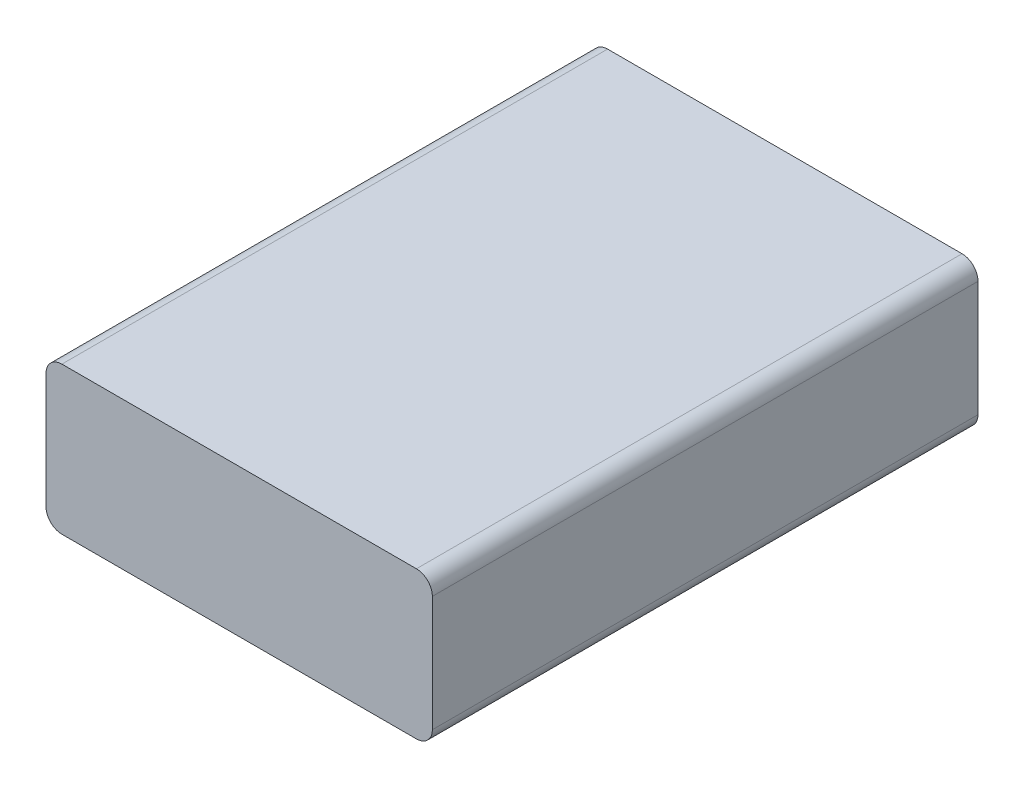
ISO-10303-21;
HEADER;
FILE_DESCRIPTION(('STEP AP214'),'2;1');
FILE_NAME('part.step','',(''),(''),'','','');
FILE_SCHEMA(('AUTOMOTIVE_DESIGN { 1 0 10303 214 1 1 1 1 }'));
ENDSEC;
DATA;
#1=APPLICATION_CONTEXT('core data for automotive mechanical design processes');
#2=APPLICATION_PROTOCOL_DEFINITION('international standard','automotive_design',2000,#1);
#3=PRODUCT_CONTEXT('',#1,'mechanical');
#4=PRODUCT('Part','Part','',(#3));
#5=PRODUCT_RELATED_PRODUCT_CATEGORY('part','',(#4));
#6=PRODUCT_DEFINITION_FORMATION('','',#4);
#7=PRODUCT_DEFINITION_CONTEXT('part definition',#1,'design');
#8=PRODUCT_DEFINITION('design','',#6,#7);
#9=PRODUCT_DEFINITION_SHAPE('','',#8);
#10=(LENGTH_UNIT() NAMED_UNIT(*) SI_UNIT(.MILLI.,.METRE.));
#11=(NAMED_UNIT(*) PLANE_ANGLE_UNIT() SI_UNIT($,.RADIAN.));
#12=(NAMED_UNIT(*) SI_UNIT($,.STERADIAN.) SOLID_ANGLE_UNIT());
#13=UNCERTAINTY_MEASURE_WITH_UNIT(LENGTH_MEASURE(1.E-05),#10,'distance_accuracy_value','');
#14=(GEOMETRIC_REPRESENTATION_CONTEXT(3) GLOBAL_UNCERTAINTY_ASSIGNED_CONTEXT((#13)) GLOBAL_UNIT_ASSIGNED_CONTEXT((#10,
#11,#12)) REPRESENTATION_CONTEXT('',''));
#15=CARTESIAN_POINT('',(0.,0.,0.));
#16=DIRECTION('',(0.,0.,1.));
#17=DIRECTION('',(1.,0.,0.));
#18=AXIS2_PLACEMENT_3D('',#15,#16,#17);
#19=CARTESIAN_POINT('',(24.25,18.5,34.25));
#20=DIRECTION('',(-1.,0.,0.));
#21=DIRECTION('',(0.,0.,1.));
#22=AXIS2_PLACEMENT_3D('',#19,#20,#21);
#23=PLANE('',#22);
#24=DIRECTION('',(0.,-1.,0.));
#25=VECTOR('',#24,1.);
#26=CARTESIAN_POINT('',(24.25,18.5,34.25));
#27=LINE('',#26,#25);
#28=CARTESIAN_POINT('',(24.25,16.5,34.25));
#29=VERTEX_POINT('',#28);
#30=CARTESIAN_POINT('',(24.25,2.,34.25));
#31=VERTEX_POINT('',#30);
#32=EDGE_CURVE('E132',#29,#31,#27,.T.);
#33=ORIENTED_EDGE('',*,*,#32,.T.);
#34=DIRECTION('',(0.,0.,-1.));
#35=VECTOR('',#34,1.);
#36=CARTESIAN_POINT('',(24.25,2.,-34.25));
#37=LINE('',#36,#35);
#38=CARTESIAN_POINT('',(24.25,2.,-34.25));
#39=VERTEX_POINT('',#38);
#40=EDGE_CURVE('E171',#31,#39,#37,.T.);
#41=ORIENTED_EDGE('',*,*,#40,.T.);
#42=DIRECTION('',(0.,-1.,0.));
#43=VECTOR('',#42,1.);
#44=CARTESIAN_POINT('',(24.25,18.5,-34.25));
#45=LINE('',#44,#43);
#46=CARTESIAN_POINT('',(24.25,16.5,-34.25));
#47=VERTEX_POINT('',#46);
#48=EDGE_CURVE('E138',#47,#39,#45,.T.);
#49=ORIENTED_EDGE('',*,*,#48,.F.);
#50=DIRECTION('',(0.,0.,-1.));
#51=VECTOR('',#50,1.);
#52=CARTESIAN_POINT('',(24.25,16.5,34.25));
#53=LINE('',#52,#51);
#54=EDGE_CURVE('E168',#47,#29,#53,.F.);
#55=ORIENTED_EDGE('',*,*,#54,.T.);
#56=EDGE_LOOP('',(#33,#41,#49,#55));
#57=FACE_BOUND('',#56,.T.);
#58=ADVANCED_FACE('F41',(#57),#23,.F.);
#59=CARTESIAN_POINT('',(-24.25,18.5,-34.25));
#60=DIRECTION('',(0.,0.,1.));
#61=DIRECTION('',(1.,0.,0.));
#62=AXIS2_PLACEMENT_3D('',#59,#60,#61);
#63=PLANE('',#62);
#64=DIRECTION('',(-1.,0.,0.));
#65=VECTOR('',#64,1.);
#66=CARTESIAN_POINT('',(-24.25,0.,-34.25));
#67=LINE('',#66,#65);
#68=CARTESIAN_POINT('',(22.25,0.,-34.25));
#69=VERTEX_POINT('',#68);
#70=CARTESIAN_POINT('',(-22.25,0.,-34.25));
#71=VERTEX_POINT('',#70);
#72=EDGE_CURVE('E191',#69,#71,#67,.T.);
#73=ORIENTED_EDGE('',*,*,#72,.T.);
#74=CARTESIAN_POINT('',(-22.25,2.,-34.25));
#75=DIRECTION('',(0.,0.,1.));
#76=DIRECTION('',(1.,0.,0.));
#77=AXIS2_PLACEMENT_3D('',#74,#75,#76);
#78=CIRCLE('',#77,2.);
#79=CARTESIAN_POINT('',(-24.25,2.,-34.25));
#80=VERTEX_POINT('',#79);
#81=EDGE_CURVE('E165',#71,#80,#78,.F.);
#82=ORIENTED_EDGE('',*,*,#81,.T.);
#83=DIRECTION('',(0.,-1.,0.));
#84=VECTOR('',#83,1.);
#85=CARTESIAN_POINT('',(-24.25,18.5,-34.25));
#86=LINE('',#85,#84);
#87=CARTESIAN_POINT('',(-24.25,16.5,-34.25));
#88=VERTEX_POINT('',#87);
#89=EDGE_CURVE('E131',#88,#80,#86,.T.);
#90=ORIENTED_EDGE('',*,*,#89,.F.);
#91=CARTESIAN_POINT('',(-22.25,16.5,-34.25));
#92=DIRECTION('',(0.,0.,1.));
#93=DIRECTION('',(1.,0.,0.));
#94=AXIS2_PLACEMENT_3D('',#91,#92,#93);
#95=CIRCLE('',#94,2.);
#96=CARTESIAN_POINT('',(-22.25,18.5,-34.25));
#97=VERTEX_POINT('',#96);
#98=EDGE_CURVE('E136',#88,#97,#95,.F.);
#99=ORIENTED_EDGE('',*,*,#98,.T.);
#100=DIRECTION('',(-1.,0.,0.));
#101=VECTOR('',#100,1.);
#102=CARTESIAN_POINT('',(-24.25,18.5,-34.25));
#103=LINE('',#102,#101);
#104=CARTESIAN_POINT('',(22.25,18.5,-34.25));
#105=VERTEX_POINT('',#104);
#106=EDGE_CURVE('E179',#105,#97,#103,.T.);
#107=ORIENTED_EDGE('',*,*,#106,.F.);
#108=CARTESIAN_POINT('',(22.25,16.5,-34.25));
#109=DIRECTION('',(0.,0.,1.));
#110=DIRECTION('',(1.,0.,0.));
#111=AXIS2_PLACEMENT_3D('',#108,#109,#110);
#112=CIRCLE('',#111,2.);
#113=EDGE_CURVE('E65',#105,#47,#112,.F.);
#114=ORIENTED_EDGE('',*,*,#113,.T.);
#115=ORIENTED_EDGE('',*,*,#48,.T.);
#116=CARTESIAN_POINT('',(22.25,2.,-34.25));
#117=DIRECTION('',(0.,0.,1.));
#118=DIRECTION('',(1.,0.,0.));
#119=AXIS2_PLACEMENT_3D('',#116,#117,#118);
#120=CIRCLE('',#119,2.);
#121=EDGE_CURVE('E57',#39,#69,#120,.F.);
#122=ORIENTED_EDGE('',*,*,#121,.T.);
#123=EDGE_LOOP('',(#73,#82,#90,#99,#107,#114,#115,#122));
#124=FACE_BOUND('',#123,.T.);
#125=ADVANCED_FACE('F183',(#124),#63,.F.);
#126=CARTESIAN_POINT('',(-24.25,18.5,34.25));
#127=DIRECTION('',(1.,0.,0.));
#128=DIRECTION('',(0.,0.,-1.));
#129=AXIS2_PLACEMENT_3D('',#126,#127,#128);
#130=PLANE('',#129);
#131=ORIENTED_EDGE('',*,*,#89,.T.);
#132=DIRECTION('',(0.,0.,1.));
#133=VECTOR('',#132,1.);
#134=CARTESIAN_POINT('',(-24.25,2.,34.25));
#135=LINE('',#134,#133);
#136=CARTESIAN_POINT('',(-24.25,2.,34.25));
#137=VERTEX_POINT('',#136);
#138=EDGE_CURVE('E129',#80,#137,#135,.T.);
#139=ORIENTED_EDGE('',*,*,#138,.T.);
#140=DIRECTION('',(0.,-1.,0.));
#141=VECTOR('',#140,1.);
#142=CARTESIAN_POINT('',(-24.25,18.5,34.25));
#143=LINE('',#142,#141);
#144=CARTESIAN_POINT('',(-24.25,16.5,34.25));
#145=VERTEX_POINT('',#144);
#146=EDGE_CURVE('E112',#145,#137,#143,.T.);
#147=ORIENTED_EDGE('',*,*,#146,.F.);
#148=DIRECTION('',(0.,0.,1.));
#149=VECTOR('',#148,1.);
#150=CARTESIAN_POINT('',(-24.25,16.5,34.25));
#151=LINE('',#150,#149);
#152=EDGE_CURVE('E126',#145,#88,#151,.F.);
#153=ORIENTED_EDGE('',*,*,#152,.T.);
#154=EDGE_LOOP('',(#131,#139,#147,#153));
#155=FACE_BOUND('',#154,.T.);
#156=ADVANCED_FACE('F125',(#155),#130,.F.);
#157=CARTESIAN_POINT('',(-24.25,18.5,34.25));
#158=DIRECTION('',(0.,0.,-1.));
#159=DIRECTION('',(-1.,0.,0.));
#160=AXIS2_PLACEMENT_3D('',#157,#158,#159);
#161=PLANE('',#160);
#162=ORIENTED_EDGE('',*,*,#146,.T.);
#163=CARTESIAN_POINT('',(-22.25,2.,34.25));
#164=DIRECTION('',(0.,0.,-1.));
#165=DIRECTION('',(-1.,0.,0.));
#166=AXIS2_PLACEMENT_3D('',#163,#164,#165);
#167=CIRCLE('',#166,2.);
#168=CARTESIAN_POINT('',(-22.25,0.,34.25));
#169=VERTEX_POINT('',#168);
#170=EDGE_CURVE('E150',#137,#169,#167,.F.);
#171=ORIENTED_EDGE('',*,*,#170,.T.);
#172=DIRECTION('',(1.,0.,0.));
#173=VECTOR('',#172,1.);
#174=CARTESIAN_POINT('',(-24.25,0.,34.25));
#175=LINE('',#174,#173);
#176=CARTESIAN_POINT('',(22.25,0.,34.25));
#177=VERTEX_POINT('',#176);
#178=EDGE_CURVE('E185',#169,#177,#175,.T.);
#179=ORIENTED_EDGE('',*,*,#178,.T.);
#180=CARTESIAN_POINT('',(22.25,2.,34.25));
#181=DIRECTION('',(0.,0.,-1.));
#182=DIRECTION('',(-1.,0.,0.));
#183=AXIS2_PLACEMENT_3D('',#180,#181,#182);
#184=CIRCLE('',#183,2.);
#185=EDGE_CURVE('E119',#177,#31,#184,.F.);
#186=ORIENTED_EDGE('',*,*,#185,.T.);
#187=ORIENTED_EDGE('',*,*,#32,.F.);
#188=CARTESIAN_POINT('',(22.25,16.5,34.25));
#189=DIRECTION('',(0.,0.,-1.));
#190=DIRECTION('',(-1.,0.,0.));
#191=AXIS2_PLACEMENT_3D('',#188,#189,#190);
#192=CIRCLE('',#191,2.);
#193=CARTESIAN_POINT('',(22.25,18.5,34.25));
#194=VERTEX_POINT('',#193);
#195=EDGE_CURVE('E120',#29,#194,#192,.F.);
#196=ORIENTED_EDGE('',*,*,#195,.T.);
#197=DIRECTION('',(1.,0.,0.));
#198=VECTOR('',#197,1.);
#199=CARTESIAN_POINT('',(-24.25,18.5,34.25));
#200=LINE('',#199,#198);
#201=CARTESIAN_POINT('',(-22.25,18.5,34.25));
#202=VERTEX_POINT('',#201);
#203=EDGE_CURVE('E114',#202,#194,#200,.T.);
#204=ORIENTED_EDGE('',*,*,#203,.F.);
#205=CARTESIAN_POINT('',(-22.25,16.5,34.25));
#206=DIRECTION('',(0.,0.,-1.));
#207=DIRECTION('',(-1.,0.,0.));
#208=AXIS2_PLACEMENT_3D('',#205,#206,#207);
#209=CIRCLE('',#208,2.);
#210=EDGE_CURVE('E109',#202,#145,#209,.F.);
#211=ORIENTED_EDGE('',*,*,#210,.T.);
#212=EDGE_LOOP('',(#162,#171,#179,#186,#187,#196,#204,#211));
#213=FACE_BOUND('',#212,.T.);
#214=ADVANCED_FACE('F111',(#213),#161,.F.);
#215=CARTESIAN_POINT('',(0.,18.5,0.));
#216=DIRECTION('',(0.,-1.,0.));
#217=DIRECTION('',(0.,0.,-1.));
#218=AXIS2_PLACEMENT_3D('',#215,#216,#217);
#219=PLANE('',#218);
#220=ORIENTED_EDGE('',*,*,#106,.T.);
#221=DIRECTION('',(0.,0.,1.));
#222=VECTOR('',#221,1.);
#223=CARTESIAN_POINT('',(-22.25,18.5,0.));
#224=LINE('',#223,#222);
#225=EDGE_CURVE('E11',#97,#202,#224,.T.);
#226=ORIENTED_EDGE('',*,*,#225,.T.);
#227=ORIENTED_EDGE('',*,*,#203,.T.);
#228=DIRECTION('',(0.,0.,-1.));
#229=VECTOR('',#228,1.);
#230=CARTESIAN_POINT('',(22.25,18.5,0.));
#231=LINE('',#230,#229);
#232=EDGE_CURVE('E50',#194,#105,#231,.T.);
#233=ORIENTED_EDGE('',*,*,#232,.T.);
#234=EDGE_LOOP('',(#220,#226,#227,#233));
#235=FACE_BOUND('',#234,.T.);
#236=ADVANCED_FACE('F178',(#235),#219,.F.);
#237=CARTESIAN_POINT('',(0.,0.,0.));
#238=DIRECTION('',(0.,-1.,0.));
#239=DIRECTION('',(0.,0.,-1.));
#240=AXIS2_PLACEMENT_3D('',#237,#238,#239);
#241=PLANE('',#240);
#242=ORIENTED_EDGE('',*,*,#178,.F.);
#243=DIRECTION('',(0.,0.,1.));
#244=VECTOR('',#243,1.);
#245=CARTESIAN_POINT('',(-22.25,0.,-34.25));
#246=LINE('',#245,#244);
#247=EDGE_CURVE('E156',#169,#71,#246,.F.);
#248=ORIENTED_EDGE('',*,*,#247,.T.);
#249=ORIENTED_EDGE('',*,*,#72,.F.);
#250=DIRECTION('',(0.,0.,-1.));
#251=VECTOR('',#250,1.);
#252=CARTESIAN_POINT('',(22.25,0.,34.25));
#253=LINE('',#252,#251);
#254=EDGE_CURVE('E153',#69,#177,#253,.F.);
#255=ORIENTED_EDGE('',*,*,#254,.T.);
#256=EDGE_LOOP('',(#242,#248,#249,#255));
#257=FACE_BOUND('',#256,.T.);
#258=ADVANCED_FACE('F206',(#257),#241,.T.);
#259=CARTESIAN_POINT('',(-22.25,2.,34.25));
#260=DIRECTION('',(0.,0.,-1.));
#261=DIRECTION('',(-1.,0.,0.));
#262=AXIS2_PLACEMENT_3D('',#259,#260,#261);
#263=CYLINDRICAL_SURFACE('',#262,2.);
#264=ORIENTED_EDGE('',*,*,#81,.F.);
#265=ORIENTED_EDGE('',*,*,#247,.F.);
#266=ORIENTED_EDGE('',*,*,#170,.F.);
#267=ORIENTED_EDGE('',*,*,#138,.F.);
#268=EDGE_LOOP('',(#264,#265,#266,#267));
#269=FACE_BOUND('',#268,.T.);
#270=ADVANCED_FACE('F201',(#269),#263,.T.);
#271=CARTESIAN_POINT('',(22.25,2.,34.25));
#272=DIRECTION('',(0.,0.,1.));
#273=DIRECTION('',(1.,0.,0.));
#274=AXIS2_PLACEMENT_3D('',#271,#272,#273);
#275=CYLINDRICAL_SURFACE('',#274,2.);
#276=ORIENTED_EDGE('',*,*,#185,.F.);
#277=ORIENTED_EDGE('',*,*,#254,.F.);
#278=ORIENTED_EDGE('',*,*,#121,.F.);
#279=ORIENTED_EDGE('',*,*,#40,.F.);
#280=EDGE_LOOP('',(#276,#277,#278,#279));
#281=FACE_BOUND('',#280,.T.);
#282=ADVANCED_FACE('F208',(#281),#275,.T.);
#283=CARTESIAN_POINT('',(-22.25,16.5,0.));
#284=DIRECTION('',(0.,0.,1.));
#285=DIRECTION('',(1.,0.,0.));
#286=AXIS2_PLACEMENT_3D('',#283,#284,#285);
#287=CYLINDRICAL_SURFACE('',#286,2.);
#288=ORIENTED_EDGE('',*,*,#98,.F.);
#289=ORIENTED_EDGE('',*,*,#152,.F.);
#290=ORIENTED_EDGE('',*,*,#210,.F.);
#291=ORIENTED_EDGE('',*,*,#225,.F.);
#292=EDGE_LOOP('',(#288,#289,#290,#291));
#293=FACE_BOUND('',#292,.T.);
#294=ADVANCED_FACE('F135',(#293),#287,.T.);
#295=CARTESIAN_POINT('',(22.25,16.5,0.));
#296=DIRECTION('',(0.,0.,-1.));
#297=DIRECTION('',(-1.,0.,0.));
#298=AXIS2_PLACEMENT_3D('',#295,#296,#297);
#299=CYLINDRICAL_SURFACE('',#298,2.);
#300=ORIENTED_EDGE('',*,*,#195,.F.);
#301=ORIENTED_EDGE('',*,*,#54,.F.);
#302=ORIENTED_EDGE('',*,*,#113,.F.);
#303=ORIENTED_EDGE('',*,*,#232,.F.);
#304=EDGE_LOOP('',(#300,#301,#302,#303));
#305=FACE_BOUND('',#304,.T.);
#306=ADVANCED_FACE('F43',(#305),#299,.T.);
#307=CLOSED_SHELL('',(#58,#125,#156,#214,#236,#258,#270,#282,#294,#306));
#308=MANIFOLD_SOLID_BREP('B2',#307);
#309=ADVANCED_BREP_SHAPE_REPRESENTATION('',(#18,#308),#14);
#310=SHAPE_DEFINITION_REPRESENTATION(#9,#309);
ENDSEC;
END-ISO-10303-21;
